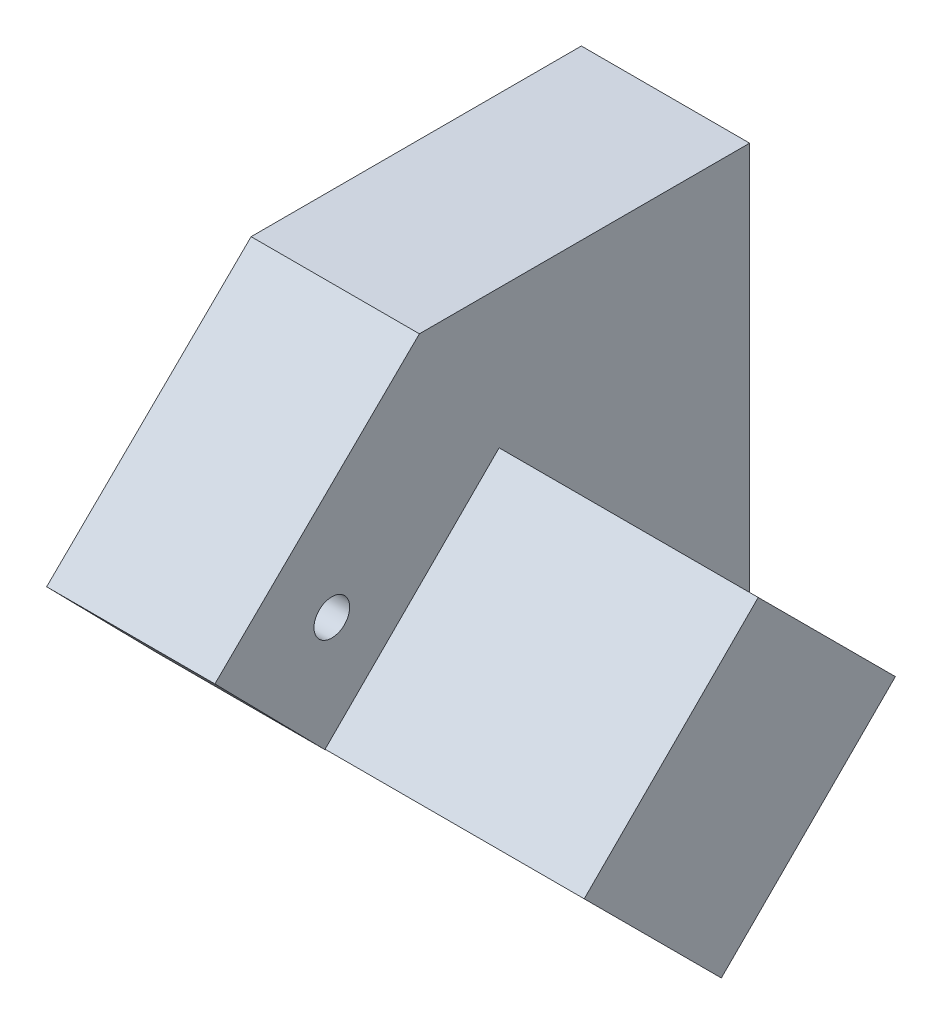
ISO-10303-21;
HEADER;
FILE_DESCRIPTION(('STEP AP214'),'2;1');
FILE_NAME('part.step','',(''),(''),'','','');
FILE_SCHEMA(('AUTOMOTIVE_DESIGN { 1 0 10303 214 1 1 1 1 }'));
ENDSEC;
DATA;
#1=APPLICATION_CONTEXT('core data for automotive mechanical design processes');
#2=APPLICATION_PROTOCOL_DEFINITION('international standard','automotive_design',2000,#1);
#3=PRODUCT_CONTEXT('',#1,'mechanical');
#4=PRODUCT('Part','Part','',(#3));
#5=PRODUCT_RELATED_PRODUCT_CATEGORY('part','',(#4));
#6=PRODUCT_DEFINITION_FORMATION('','',#4);
#7=PRODUCT_DEFINITION_CONTEXT('part definition',#1,'design');
#8=PRODUCT_DEFINITION('design','',#6,#7);
#9=PRODUCT_DEFINITION_SHAPE('','',#8);
#10=(LENGTH_UNIT() NAMED_UNIT(*) SI_UNIT(.MILLI.,.METRE.));
#11=(NAMED_UNIT(*) PLANE_ANGLE_UNIT() SI_UNIT($,.RADIAN.));
#12=(NAMED_UNIT(*) SI_UNIT($,.STERADIAN.) SOLID_ANGLE_UNIT());
#13=UNCERTAINTY_MEASURE_WITH_UNIT(LENGTH_MEASURE(1.E-05),#10,'distance_accuracy_value','');
#14=(GEOMETRIC_REPRESENTATION_CONTEXT(3) GLOBAL_UNCERTAINTY_ASSIGNED_CONTEXT((#13)) GLOBAL_UNIT_ASSIGNED_CONTEXT((#10,
#11,#12)) REPRESENTATION_CONTEXT('',''));
#15=CARTESIAN_POINT('',(0.,0.,0.));
#16=DIRECTION('',(0.,0.,1.));
#17=DIRECTION('',(1.,0.,0.));
#18=AXIS2_PLACEMENT_3D('',#15,#16,#17);
#19=CARTESIAN_POINT('',(0.,-34.0018996616509,4.15689966165091));
#20=DIRECTION('',(0.,-0.707106781186547,0.707106781186548));
#21=DIRECTION('',(0.,-0.707106781186548,-0.707106781186547));
#22=AXIS2_PLACEMENT_3D('',#19,#20,#21);
#23=PLANE('',#22);
#24=DIRECTION('',(0.,0.707106781186548,0.707106781186547));
#25=VECTOR('',#24,1.);
#26=CARTESIAN_POINT('',(10.16,-36.0719996616509,2.08679966165091));
#27=LINE('',#26,#25);
#28=CARTESIAN_POINT('',(10.16,-42.2822996616509,-4.12350033834909));
#29=VERTEX_POINT('',#28);
#30=CARTESIAN_POINT('',(10.16,-40.0558,-1.89700067669817));
#31=VERTEX_POINT('',#30);
#32=EDGE_CURVE('E234',#29,#31,#27,.T.);
#33=ORIENTED_EDGE('',*,*,#32,.T.);
#34=DIRECTION('',(-1.,0.,0.));
#35=VECTOR('',#34,1.);
#36=CARTESIAN_POINT('',(0.,-40.0558,-1.89700067669817));
#37=LINE('',#36,#35);
#38=CARTESIAN_POINT('',(0.,-40.0558,-1.89700067669817));
#39=VERTEX_POINT('',#38);
#40=EDGE_CURVE('E245',#31,#39,#37,.T.);
#41=ORIENTED_EDGE('',*,*,#40,.T.);
#42=DIRECTION('',(0.,-0.707106781186548,-0.707106781186547));
#43=VECTOR('',#42,1.);
#44=CARTESIAN_POINT('',(0.,-34.0018996616509,4.15689966165091));
#45=LINE('',#44,#43);
#46=CARTESIAN_POINT('',(0.,-42.2822996616509,-4.12350033834909));
#47=VERTEX_POINT('',#46);
#48=EDGE_CURVE('E277',#39,#47,#45,.T.);
#49=ORIENTED_EDGE('',*,*,#48,.T.);
#50=DIRECTION('',(1.,0.,0.));
#51=VECTOR('',#50,1.);
#52=CARTESIAN_POINT('',(0.,-42.2822996616509,-4.12350033834909));
#53=LINE('',#52,#51);
#54=EDGE_CURVE('E10',#47,#29,#53,.T.);
#55=ORIENTED_EDGE('',*,*,#54,.T.);
#56=EDGE_LOOP('',(#33,#41,#49,#55));
#57=FACE_BOUND('',#56,.T.);
#58=ADVANCED_FACE('F16',(#57),#23,.T.);
#59=CARTESIAN_POINT('',(0.,0.,-6.35));
#60=DIRECTION('',(0.,1.,0.));
#61=DIRECTION('',(0.,0.,1.));
#62=AXIS2_PLACEMENT_3D('',#59,#60,#61);
#63=PLANE('',#62);
#64=DIRECTION('',(0.,0.,-1.));
#65=VECTOR('',#64,1.);
#66=CARTESIAN_POINT('',(10.16,0.,-4.61570245519068));
#67=LINE('',#66,#65);
#68=CARTESIAN_POINT('',(10.16,0.,13.5894839503606));
#69=VERTEX_POINT('',#68);
#70=CARTESIAN_POINT('',(10.16,0.,-6.35));
#71=VERTEX_POINT('',#70);
#72=EDGE_CURVE('E237',#69,#71,#67,.T.);
#73=ORIENTED_EDGE('',*,*,#72,.T.);
#74=DIRECTION('',(1.,0.,0.));
#75=VECTOR('',#74,1.);
#76=CARTESIAN_POINT('',(0.,0.,-6.35));
#77=LINE('',#76,#75);
#78=CARTESIAN_POINT('',(0.,0.,-6.35));
#79=VERTEX_POINT('',#78);
#80=EDGE_CURVE('E129',#79,#71,#77,.T.);
#81=ORIENTED_EDGE('',*,*,#80,.F.);
#82=DIRECTION('',(0.,0.,1.));
#83=VECTOR('',#82,1.);
#84=CARTESIAN_POINT('',(0.,0.,-6.35));
#85=LINE('',#84,#83);
#86=CARTESIAN_POINT('',(0.,0.,13.5894839503606));
#87=VERTEX_POINT('',#86);
#88=EDGE_CURVE('E175',#79,#87,#85,.T.);
#89=ORIENTED_EDGE('',*,*,#88,.T.);
#90=DIRECTION('',(-1.,0.,0.));
#91=VECTOR('',#90,1.);
#92=CARTESIAN_POINT('',(10.16,0.,13.5894839503606));
#93=LINE('',#92,#91);
#94=EDGE_CURVE('E166',#69,#87,#93,.T.);
#95=ORIENTED_EDGE('',*,*,#94,.F.);
#96=EDGE_LOOP('',(#73,#81,#89,#95));
#97=FACE_BOUND('',#96,.T.);
#98=ADVANCED_FACE('F320',(#97),#63,.T.);
#99=CARTESIAN_POINT('',(0.,-40.0558,-6.35));
#100=DIRECTION('',(0.,-0.707106781186548,-0.707106781186548));
#101=DIRECTION('',(0.,0.707106781186548,-0.707106781186548));
#102=AXIS2_PLACEMENT_3D('',#99,#100,#101);
#103=PLANE('',#102);
#104=DIRECTION('',(0.,-0.707106781186548,0.707106781186548));
#105=VECTOR('',#104,1.);
#106=CARTESIAN_POINT('',(10.16,-38.5423249154127,-7.86347508458728));
#107=LINE('',#106,#105);
#108=CARTESIAN_POINT('',(10.16,-40.0558,-6.35));
#109=VERTEX_POINT('',#108);
#110=EDGE_CURVE('E286',#109,#29,#107,.T.);
#111=ORIENTED_EDGE('',*,*,#110,.T.);
#112=ORIENTED_EDGE('',*,*,#54,.F.);
#113=DIRECTION('',(0.,0.707106781186548,-0.707106781186548));
#114=VECTOR('',#113,1.);
#115=CARTESIAN_POINT('',(0.,-42.2822996616509,-4.12350033834909));
#116=LINE('',#115,#114);
#117=CARTESIAN_POINT('',(0.,-40.0558,-6.35));
#118=VERTEX_POINT('',#117);
#119=EDGE_CURVE('E241',#47,#118,#116,.T.);
#120=ORIENTED_EDGE('',*,*,#119,.T.);
#121=DIRECTION('',(1.,0.,0.));
#122=VECTOR('',#121,1.);
#123=CARTESIAN_POINT('',(0.,-40.0558,-6.35));
#124=LINE('',#123,#122);
#125=EDGE_CURVE('E136',#118,#109,#124,.T.);
#126=ORIENTED_EDGE('',*,*,#125,.T.);
#127=EDGE_LOOP('',(#111,#112,#120,#126));
#128=FACE_BOUND('',#127,.T.);
#129=ADVANCED_FACE('F326',(#128),#103,.T.);
#130=CARTESIAN_POINT('',(0.,-34.0018996616509,4.15689966165091));
#131=DIRECTION('',(0.,-0.707106781186547,0.707106781186548));
#132=DIRECTION('',(0.,-0.707106781186548,-0.707106781186547));
#133=AXIS2_PLACEMENT_3D('',#130,#131,#132);
#134=PLANE('',#133);
#135=DIRECTION('',(0.,0.707106781186548,0.707106781186547));
#136=VECTOR('',#135,1.);
#137=CARTESIAN_POINT('',(10.16,-36.0719996616509,2.08679966165091));
#138=LINE('',#137,#136);
#139=CARTESIAN_POINT('',(10.16,-38.1587993233018,0.));
#140=VERTEX_POINT('',#139);
#141=CARTESIAN_POINT('',(10.16,-27.1554423882763,11.0033569350258));
#142=VERTEX_POINT('',#141);
#143=EDGE_CURVE('E189',#140,#142,#138,.T.);
#144=ORIENTED_EDGE('',*,*,#143,.T.);
#145=DIRECTION('',(1.,0.,0.));
#146=VECTOR('',#145,1.);
#147=CARTESIAN_POINT('',(12.1412,-27.1554423882762,11.0033569350256));
#148=LINE('',#147,#146);
#149=CARTESIAN_POINT('',(25.8064,-27.1554423882762,11.0033569350256));
#150=VERTEX_POINT('',#149);
#151=EDGE_CURVE('E219',#142,#150,#148,.T.);
#152=ORIENTED_EDGE('',*,*,#151,.T.);
#153=DIRECTION('',(0.,-0.707106781186548,-0.707106781186548));
#154=VECTOR('',#153,1.);
#155=CARTESIAN_POINT('',(25.8064,-18.8756462446504,19.2831530786514));
#156=LINE('',#155,#154);
#157=CARTESIAN_POINT('',(25.8064,-18.8756462446504,19.2831530786514));
#158=VERTEX_POINT('',#157);
#159=EDGE_CURVE('E34',#158,#150,#156,.T.);
#160=ORIENTED_EDGE('',*,*,#159,.F.);
#161=DIRECTION('',(1.,0.,0.));
#162=VECTOR('',#161,1.);
#163=CARTESIAN_POINT('',(12.1412,-18.8756462446504,19.2831530786514));
#164=LINE('',#163,#162);
#165=CARTESIAN_POINT('',(10.16,-18.8756462446504,19.2831530786514));
#166=VERTEX_POINT('',#165);
#167=EDGE_CURVE('E226',#166,#158,#164,.T.);
#168=ORIENTED_EDGE('',*,*,#167,.F.);
#169=DIRECTION('',(0.,-0.707106781186548,-0.707106781186548));
#170=VECTOR('',#169,1.);
#171=CARTESIAN_POINT('',(10.16,-17.4898214483012,20.6689778750006));
#172=LINE('',#171,#170);
#173=CARTESIAN_POINT('',(10.16,-18.9129057166653,19.2458936066365));
#174=VERTEX_POINT('',#173);
#175=EDGE_CURVE('E257',#166,#174,#172,.T.);
#176=ORIENTED_EDGE('',*,*,#175,.T.);
#177=DIRECTION('',(-1.,0.,0.));
#178=VECTOR('',#177,1.);
#179=CARTESIAN_POINT('',(11.1506,-18.9129057166653,19.2458936066365));
#180=LINE('',#179,#178);
#181=CARTESIAN_POINT('',(0.,-18.9129057166653,19.2458936066365));
#182=VERTEX_POINT('',#181);
#183=EDGE_CURVE('E197',#174,#182,#180,.T.);
#184=ORIENTED_EDGE('',*,*,#183,.T.);
#185=DIRECTION('',(0.,0.707106781186547,0.707106781186548));
#186=VECTOR('',#185,1.);
#187=CARTESIAN_POINT('',(0.,-25.0854933523698,13.0733059709321));
#188=LINE('',#187,#186);
#189=CARTESIAN_POINT('',(0.,-38.1587993233018,0.));
#190=VERTEX_POINT('',#189);
#191=EDGE_CURVE('E183',#190,#182,#188,.T.);
#192=ORIENTED_EDGE('',*,*,#191,.F.);
#193=DIRECTION('',(1.,0.,0.));
#194=VECTOR('',#193,1.);
#195=CARTESIAN_POINT('',(0.,-38.1587993233018,0.));
#196=LINE('',#195,#194);
#197=EDGE_CURVE('E243',#190,#140,#196,.T.);
#198=ORIENTED_EDGE('',*,*,#197,.T.);
#199=EDGE_LOOP('',(#144,#152,#160,#168,#176,#184,#192,#198));
#200=FACE_BOUND('',#199,.T.);
#201=CARTESIAN_POINT('',(19.2656923686453,-23.0155443164633,15.1432550068385));
#202=DIRECTION('',(0.,0.707106781186548,-0.707106781186547));
#203=DIRECTION('',(1.,0.,0.));
#204=AXIS2_PLACEMENT_3D('',#201,#202,#203);
#205=CIRCLE('',#204,4.5085);
#206=CARTESIAN_POINT('',(14.7571923686453,-23.0155443164633,15.1432550068385));
#207=VERTEX_POINT('',#206);
#208=EDGE_CURVE('E207',#207,#207,#205,.T.);
#209=ORIENTED_EDGE('',*,*,#208,.T.);
#210=EDGE_LOOP('',(#209));
#211=FACE_BOUND('',#210,.T.);
#212=ADVANCED_FACE('F331',(#200,#211),#134,.T.);
#213=CARTESIAN_POINT('',(0.,-5.08,-7.62));
#214=DIRECTION('',(-1.,0.,0.));
#215=DIRECTION('',(0.,0.,-1.));
#216=AXIS2_PLACEMENT_3D('',#213,#214,#215);
#217=CYLINDRICAL_SURFACE('',#216,2.54);
#218=DIRECTION('',(-1.,0.,0.));
#219=VECTOR('',#218,1.);
#220=CARTESIAN_POINT('',(0.,-2.88029547438753,-6.35));
#221=LINE('',#220,#219);
#222=CARTESIAN_POINT('',(6.35,-2.88029547438753,-6.35));
#223=VERTEX_POINT('',#222);
#224=CARTESIAN_POINT('',(0.,-2.88029547438753,-6.35));
#225=VERTEX_POINT('',#224);
#226=EDGE_CURVE('E214',#223,#225,#221,.T.);
#227=ORIENTED_EDGE('',*,*,#226,.F.);
#228=CARTESIAN_POINT('',(6.35,-5.08,-7.62));
#229=DIRECTION('',(1.,0.,0.));
#230=DIRECTION('',(0.,0.,-1.));
#231=AXIS2_PLACEMENT_3D('',#228,#229,#230);
#232=CIRCLE('',#231,2.54);
#233=CARTESIAN_POINT('',(6.35,-7.27970452561247,-6.35));
#234=VERTEX_POINT('',#233);
#235=EDGE_CURVE('E26',#234,#223,#232,.T.);
#236=ORIENTED_EDGE('',*,*,#235,.F.);
#237=DIRECTION('',(1.,0.,0.));
#238=VECTOR('',#237,1.);
#239=CARTESIAN_POINT('',(0.,-7.27970452561247,-6.35));
#240=LINE('',#239,#238);
#241=CARTESIAN_POINT('',(0.,-7.27970452561247,-6.35));
#242=VERTEX_POINT('',#241);
#243=EDGE_CURVE('E198',#242,#234,#240,.T.);
#244=ORIENTED_EDGE('',*,*,#243,.F.);
#245=CARTESIAN_POINT('',(0.,-5.08,-7.62));
#246=DIRECTION('',(1.,0.,0.));
#247=DIRECTION('',(0.,0.,-1.));
#248=AXIS2_PLACEMENT_3D('',#245,#246,#247);
#249=CIRCLE('',#248,2.54);
#250=EDGE_CURVE('E213',#242,#225,#249,.T.);
#251=ORIENTED_EDGE('',*,*,#250,.T.);
#252=EDGE_LOOP('',(#227,#236,#244,#251));
#253=FACE_BOUND('',#252,.T.);
#254=ADVANCED_FACE('F333',(#253),#217,.T.);
#255=CARTESIAN_POINT('',(6.35,-5.08,-7.62));
#256=DIRECTION('',(1.,0.,0.));
#257=DIRECTION('',(0.,0.,-1.));
#258=AXIS2_PLACEMENT_3D('',#255,#256,#257);
#259=PLANE('',#258);
#260=DIRECTION('',(0.,1.,0.));
#261=VECTOR('',#260,1.);
#262=CARTESIAN_POINT('',(6.35,-22.5679,-6.35));
#263=LINE('',#262,#261);
#264=EDGE_CURVE('E201',#234,#223,#263,.T.);
#265=ORIENTED_EDGE('',*,*,#264,.F.);
#266=ORIENTED_EDGE('',*,*,#235,.T.);
#267=EDGE_LOOP('',(#265,#266));
#268=FACE_BOUND('',#267,.T.);
#269=ADVANCED_FACE('F338',(#268),#259,.T.);
#270=CARTESIAN_POINT('',(0.,-34.9758,-7.62));
#271=DIRECTION('',(-1.,0.,0.));
#272=DIRECTION('',(0.,0.,-1.));
#273=AXIS2_PLACEMENT_3D('',#270,#271,#272);
#274=CYLINDRICAL_SURFACE('',#273,2.54);
#275=DIRECTION('',(-1.,0.,0.));
#276=VECTOR('',#275,1.);
#277=CARTESIAN_POINT('',(0.,-32.7760954743875,-6.35));
#278=LINE('',#277,#276);
#279=CARTESIAN_POINT('',(6.35,-32.7760954743875,-6.35));
#280=VERTEX_POINT('',#279);
#281=CARTESIAN_POINT('',(0.,-32.7760954743875,-6.35));
#282=VERTEX_POINT('',#281);
#283=EDGE_CURVE('E202',#280,#282,#278,.T.);
#284=ORIENTED_EDGE('',*,*,#283,.F.);
#285=CARTESIAN_POINT('',(6.35,-34.9758,-7.62));
#286=DIRECTION('',(1.,0.,0.));
#287=DIRECTION('',(0.,0.,-1.));
#288=AXIS2_PLACEMENT_3D('',#285,#286,#287);
#289=CIRCLE('',#288,2.54);
#290=CARTESIAN_POINT('',(6.35,-37.1755045256125,-6.35));
#291=VERTEX_POINT('',#290);
#292=EDGE_CURVE('E187',#291,#280,#289,.T.);
#293=ORIENTED_EDGE('',*,*,#292,.F.);
#294=DIRECTION('',(1.,0.,0.));
#295=VECTOR('',#294,1.);
#296=CARTESIAN_POINT('',(0.,-37.1755045256125,-6.35));
#297=LINE('',#296,#295);
#298=CARTESIAN_POINT('',(0.,-37.1755045256125,-6.35));
#299=VERTEX_POINT('',#298);
#300=EDGE_CURVE('E266',#299,#291,#297,.T.);
#301=ORIENTED_EDGE('',*,*,#300,.F.);
#302=CARTESIAN_POINT('',(0.,-34.9758,-7.62));
#303=DIRECTION('',(1.,0.,0.));
#304=DIRECTION('',(0.,0.,-1.));
#305=AXIS2_PLACEMENT_3D('',#302,#303,#304);
#306=CIRCLE('',#305,2.54);
#307=EDGE_CURVE('E242',#299,#282,#306,.T.);
#308=ORIENTED_EDGE('',*,*,#307,.T.);
#309=EDGE_LOOP('',(#284,#293,#301,#308));
#310=FACE_BOUND('',#309,.T.);
#311=ADVANCED_FACE('F375',(#310),#274,.T.);
#312=CARTESIAN_POINT('',(6.35,-34.9758,-7.62));
#313=DIRECTION('',(1.,0.,0.));
#314=DIRECTION('',(0.,0.,-1.));
#315=AXIS2_PLACEMENT_3D('',#312,#313,#314);
#316=PLANE('',#315);
#317=DIRECTION('',(0.,1.,0.));
#318=VECTOR('',#317,1.);
#319=CARTESIAN_POINT('',(6.35,-37.5158,-6.35));
#320=LINE('',#319,#318);
#321=EDGE_CURVE('E269',#291,#280,#320,.T.);
#322=ORIENTED_EDGE('',*,*,#321,.F.);
#323=ORIENTED_EDGE('',*,*,#292,.T.);
#324=EDGE_LOOP('',(#322,#323));
#325=FACE_BOUND('',#324,.T.);
#326=ADVANCED_FACE('F372',(#325),#316,.T.);
#327=CARTESIAN_POINT('',(26.3652,-40.0558,0.));
#328=DIRECTION('',(0.,0.,1.));
#329=DIRECTION('',(0.,1.,0.));
#330=AXIS2_PLACEMENT_3D('',#327,#328,#329);
#331=PLANE('',#330);
#332=DIRECTION('',(0.,-1.,0.));
#333=VECTOR('',#332,1.);
#334=CARTESIAN_POINT('',(10.16,-36.4722249154128,0.));
#335=LINE('',#334,#333);
#336=CARTESIAN_POINT('',(10.16,-38.1254,0.));
#337=VERTEX_POINT('',#336);
#338=EDGE_CURVE('E192',#337,#140,#335,.T.);
#339=ORIENTED_EDGE('',*,*,#338,.T.);
#340=ORIENTED_EDGE('',*,*,#197,.F.);
#341=DIRECTION('',(0.,-1.,0.));
#342=VECTOR('',#341,1.);
#343=CARTESIAN_POINT('',(0.,-35.9156,0.));
#344=LINE('',#343,#342);
#345=CARTESIAN_POINT('',(0.,-38.1254,0.));
#346=VERTEX_POINT('',#345);
#347=EDGE_CURVE('E193',#346,#190,#344,.T.);
#348=ORIENTED_EDGE('',*,*,#347,.F.);
#349=DIRECTION('',(-1.,0.,0.));
#350=VECTOR('',#349,1.);
#351=CARTESIAN_POINT('',(26.3652,-38.1254,0.));
#352=LINE('',#351,#350);
#353=EDGE_CURVE('E271',#337,#346,#352,.T.);
#354=ORIENTED_EDGE('',*,*,#353,.F.);
#355=EDGE_LOOP('',(#339,#340,#348,#354));
#356=FACE_BOUND('',#355,.T.);
#357=ADVANCED_FACE('F366',(#356),#331,.F.);
#358=CARTESIAN_POINT('',(26.3652,-38.1254,0.));
#359=DIRECTION('',(0.,0.700909617671485,-0.713250101896672));
#360=DIRECTION('',(0.,-0.713250101896672,-0.700909617671485));
#361=AXIS2_PLACEMENT_3D('',#358,#359,#360);
#362=PLANE('',#361);
#363=DIRECTION('',(0.,0.713250101896672,0.700909617671485));
#364=VECTOR('',#363,1.);
#365=CARTESIAN_POINT('',(10.16,-38.102353450991,0.0226478030800242));
#366=LINE('',#365,#364);
#367=EDGE_CURVE('E231',#31,#337,#366,.T.);
#368=ORIENTED_EDGE('',*,*,#367,.T.);
#369=ORIENTED_EDGE('',*,*,#353,.T.);
#370=DIRECTION('',(0.,0.713250101896672,0.700909617671485));
#371=VECTOR('',#370,1.);
#372=CARTESIAN_POINT('',(0.,-38.7036800386154,-0.568274774437638));
#373=LINE('',#372,#371);
#374=EDGE_CURVE('E274',#39,#346,#373,.T.);
#375=ORIENTED_EDGE('',*,*,#374,.F.);
#376=ORIENTED_EDGE('',*,*,#40,.F.);
#377=EDGE_LOOP('',(#368,#369,#375,#376));
#378=FACE_BOUND('',#377,.T.);
#379=ADVANCED_FACE('F362',(#378),#362,.F.);
#380=CARTESIAN_POINT('',(25.8064,-17.7620944856379,9.88980517601307));
#381=DIRECTION('',(1.,0.,0.));
#382=DIRECTION('',(0.,0.,-1.));
#383=AXIS2_PLACEMENT_3D('',#380,#381,#382);
#384=PLANE('',#383);
#385=DIRECTION('',(0.,0.707106781186548,0.707106781186548));
#386=VECTOR('',#385,1.);
#387=CARTESIAN_POINT('',(25.8064,-16.6485427266252,0.496457273374729));
#388=LINE('',#387,#386);
#389=CARTESIAN_POINT('',(25.8064,-16.6485427266252,0.496457273374729));
#390=VERTEX_POINT('',#389);
#391=CARTESIAN_POINT('',(25.8064,-8.36874658299951,8.77625341700049));
#392=VERTEX_POINT('',#391);
#393=EDGE_CURVE('E224',#390,#392,#388,.T.);
#394=ORIENTED_EDGE('',*,*,#393,.T.);
#395=DIRECTION('',(0.,-0.707106781186548,0.707106781186547));
#396=VECTOR('',#395,1.);
#397=CARTESIAN_POINT('',(25.8064,-8.36874658299951,8.77625341700049));
#398=LINE('',#397,#396);
#399=EDGE_CURVE('E272',#392,#158,#398,.T.);
#400=ORIENTED_EDGE('',*,*,#399,.T.);
#401=ORIENTED_EDGE('',*,*,#159,.T.);
#402=DIRECTION('',(0.,0.707106781186548,-0.707106781186547));
#403=VECTOR('',#402,1.);
#404=CARTESIAN_POINT('',(25.8064,-27.1554423882762,11.0033569350256));
#405=LINE('',#404,#403);
#406=EDGE_CURVE('E216',#150,#390,#405,.T.);
#407=ORIENTED_EDGE('',*,*,#406,.T.);
#408=EDGE_LOOP('',(#394,#400,#401,#407));
#409=FACE_BOUND('',#408,.T.);
#410=ADVANCED_FACE('F365',(#409),#384,.T.);
#411=CARTESIAN_POINT('',(12.1412,-8.36874658299951,8.77625341700049));
#412=DIRECTION('',(0.,0.707106781186547,0.707106781186548));
#413=DIRECTION('',(0.,-0.707106781186548,0.707106781186547));
#414=AXIS2_PLACEMENT_3D('',#411,#412,#413);
#415=PLANE('',#414);
#416=DIRECTION('',(0.,-0.707106781186548,0.707106781186547));
#417=VECTOR('',#416,1.);
#418=CARTESIAN_POINT('',(10.16,-9.34085864937649,9.74836548337747));
#419=LINE('',#418,#417);
#420=CARTESIAN_POINT('',(10.16,-8.36874658299951,8.77625341700049));
#421=VERTEX_POINT('',#420);
#422=EDGE_CURVE('E256',#421,#166,#419,.T.);
#423=ORIENTED_EDGE('',*,*,#422,.T.);
#424=ORIENTED_EDGE('',*,*,#167,.T.);
#425=ORIENTED_EDGE('',*,*,#399,.F.);
#426=DIRECTION('',(1.,0.,0.));
#427=VECTOR('',#426,1.);
#428=CARTESIAN_POINT('',(12.1412,-8.36874658299951,8.77625341700049));
#429=LINE('',#428,#427);
#430=EDGE_CURVE('E221',#421,#392,#429,.T.);
#431=ORIENTED_EDGE('',*,*,#430,.F.);
#432=EDGE_LOOP('',(#423,#424,#425,#431));
#433=FACE_BOUND('',#432,.T.);
#434=ADVANCED_FACE('F370',(#433),#415,.T.);
#435=CARTESIAN_POINT('',(12.1412,-27.1554423882762,11.0033569350256));
#436=DIRECTION('',(0.,-0.707106781186547,-0.707106781186548));
#437=DIRECTION('',(0.,0.707106781186548,-0.707106781186547));
#438=AXIS2_PLACEMENT_3D('',#435,#436,#437);
#439=PLANE('',#438);
#440=DIRECTION('',(0.,0.707106781186548,-0.707106781186547));
#441=VECTOR('',#440,1.);
#442=CARTESIAN_POINT('',(10.16,-25.5211392654298,9.36905381217931));
#443=LINE('',#442,#441);
#444=CARTESIAN_POINT('',(10.16,-16.6485427266252,0.496457273374729));
#445=VERTEX_POINT('',#444);
#446=EDGE_CURVE('E167',#142,#445,#443,.T.);
#447=ORIENTED_EDGE('',*,*,#446,.T.);
#448=DIRECTION('',(-1.,0.,0.));
#449=VECTOR('',#448,1.);
#450=CARTESIAN_POINT('',(12.1412,-16.6485427266252,0.496457273374729));
#451=LINE('',#450,#449);
#452=EDGE_CURVE('E220',#390,#445,#451,.T.);
#453=ORIENTED_EDGE('',*,*,#452,.F.);
#454=ORIENTED_EDGE('',*,*,#406,.F.);
#455=ORIENTED_EDGE('',*,*,#151,.F.);
#456=EDGE_LOOP('',(#447,#453,#454,#455));
#457=FACE_BOUND('',#456,.T.);
#458=ADVANCED_FACE('F357',(#457),#439,.T.);
#459=CARTESIAN_POINT('',(12.1412,-16.6485427266252,0.496457273374729));
#460=DIRECTION('',(0.,0.707106781186548,-0.707106781186548));
#461=DIRECTION('',(0.,0.707106781186548,0.707106781186548));
#462=AXIS2_PLACEMENT_3D('',#459,#460,#461);
#463=PLANE('',#462);
#464=CARTESIAN_POINT('',(19.2656923686453,-12.5086446548124,4.63635534518761));
#465=DIRECTION('',(0.,-0.707106781186548,0.707106781186547));
#466=DIRECTION('',(1.,0.,0.));
#467=AXIS2_PLACEMENT_3D('',#464,#465,#466);
#468=CIRCLE('',#467,4.5085);
#469=CARTESIAN_POINT('',(14.7571923686453,-12.5086446548124,4.63635534518761));
#470=VERTEX_POINT('',#469);
#471=EDGE_CURVE('E209',#470,#470,#468,.T.);
#472=ORIENTED_EDGE('',*,*,#471,.T.);
#473=EDGE_LOOP('',(#472));
#474=FACE_BOUND('',#473,.T.);
#475=DIRECTION('',(0.,0.707106781186548,0.707106781186548));
#476=VECTOR('',#475,1.);
#477=CARTESIAN_POINT('',(10.16,-11.1228198584632,6.0221801415368));
#478=LINE('',#477,#476);
#479=EDGE_CURVE('E253',#445,#421,#478,.T.);
#480=ORIENTED_EDGE('',*,*,#479,.T.);
#481=ORIENTED_EDGE('',*,*,#430,.T.);
#482=ORIENTED_EDGE('',*,*,#393,.F.);
#483=ORIENTED_EDGE('',*,*,#452,.T.);
#484=EDGE_LOOP('',(#480,#481,#482,#483));
#485=FACE_BOUND('',#484,.T.);
#486=ADVANCED_FACE('F348',(#474,#485),#463,.T.);
#487=CARTESIAN_POINT('',(19.2656923686453,-12.5086446548124,4.63635534518761));
#488=DIRECTION('',(0.,0.707106781186548,-0.707106781186548));
#489=DIRECTION('',(1.,0.,0.));
#490=AXIS2_PLACEMENT_3D('',#487,#488,#489);
#491=CYLINDRICAL_SURFACE('',#490,4.5085);
#492=ORIENTED_EDGE('',*,*,#471,.F.);
#493=EDGE_LOOP('',(#492));
#494=FACE_BOUND('',#493,.T.);
#495=ORIENTED_EDGE('',*,*,#208,.F.);
#496=EDGE_LOOP('',(#495));
#497=FACE_BOUND('',#496,.T.);
#498=ADVANCED_FACE('F345',(#494,#497),#491,.F.);
#499=CARTESIAN_POINT('',(0.,-40.0558,-6.35));
#500=DIRECTION('',(0.,0.,-1.));
#501=DIRECTION('',(0.,1.,0.));
#502=AXIS2_PLACEMENT_3D('',#499,#500,#501);
#503=PLANE('',#502);
#504=DIRECTION('',(0.,-1.,0.));
#505=VECTOR('',#504,1.);
#506=CARTESIAN_POINT('',(10.16,-36.4722249154128,-6.35));
#507=LINE('',#506,#505);
#508=EDGE_CURVE('E285',#71,#109,#507,.T.);
#509=ORIENTED_EDGE('',*,*,#508,.T.);
#510=ORIENTED_EDGE('',*,*,#125,.F.);
#511=DIRECTION('',(0.,-1.,0.));
#512=VECTOR('',#511,1.);
#513=CARTESIAN_POINT('',(0.,-27.6352,-6.35));
#514=LINE('',#513,#512);
#515=EDGE_CURVE('E238',#299,#118,#514,.T.);
#516=ORIENTED_EDGE('',*,*,#515,.F.);
#517=ORIENTED_EDGE('',*,*,#300,.T.);
#518=ORIENTED_EDGE('',*,*,#321,.T.);
#519=ORIENTED_EDGE('',*,*,#283,.T.);
#520=DIRECTION('',(0.,-1.,0.));
#521=VECTOR('',#520,1.);
#522=CARTESIAN_POINT('',(0.,-27.6352,-6.35));
#523=LINE('',#522,#521);
#524=EDGE_CURVE('E230',#242,#282,#523,.T.);
#525=ORIENTED_EDGE('',*,*,#524,.F.);
#526=ORIENTED_EDGE('',*,*,#243,.T.);
#527=ORIENTED_EDGE('',*,*,#264,.T.);
#528=ORIENTED_EDGE('',*,*,#226,.T.);
#529=DIRECTION('',(0.,-1.,0.));
#530=VECTOR('',#529,1.);
#531=CARTESIAN_POINT('',(0.,-27.6352,-6.35));
#532=LINE('',#531,#530);
#533=EDGE_CURVE('E210',#79,#225,#532,.T.);
#534=ORIENTED_EDGE('',*,*,#533,.F.);
#535=ORIENTED_EDGE('',*,*,#80,.T.);
#536=EDGE_LOOP('',(#509,#510,#516,#517,#518,#519,#525,#526,#527,#528,#534,#535));
#537=FACE_BOUND('',#536,.T.);
#538=ADVANCED_FACE('F347',(#537),#503,.T.);
#539=CARTESIAN_POINT('',(10.16,0.,0.));
#540=DIRECTION('',(0.,-0.713250101896672,-0.700909617671485));
#541=DIRECTION('',(0.,-0.700909617671485,0.713250101896672));
#542=AXIS2_PLACEMENT_3D('',#539,#540,#541);
#543=PLANE('',#542);
#544=ORIENTED_EDGE('',*,*,#183,.F.);
#545=DIRECTION('',(0.,0.700909617671485,-0.713250101896672));
#546=VECTOR('',#545,1.);
#547=CARTESIAN_POINT('',(10.16,-18.9273511881352,19.2605934106313));
#548=LINE('',#547,#546);
#549=CARTESIAN_POINT('',(10.16,-18.9273511881352,19.2605934106313));
#550=VERTEX_POINT('',#549);
#551=EDGE_CURVE('E205',#550,#174,#548,.T.);
#552=ORIENTED_EDGE('',*,*,#551,.F.);
#553=DIRECTION('',(-1.,0.,0.));
#554=VECTOR('',#553,1.);
#555=CARTESIAN_POINT('',(10.16,-18.9273511881352,19.2605934106313));
#556=LINE('',#555,#554);
#557=CARTESIAN_POINT('',(0.,-18.9273511881352,19.2605934106313));
#558=VERTEX_POINT('',#557);
#559=EDGE_CURVE('E194',#550,#558,#556,.T.);
#560=ORIENTED_EDGE('',*,*,#559,.T.);
#561=DIRECTION('',(0.,-0.700909617671485,0.713250101896672));
#562=VECTOR('',#561,1.);
#563=CARTESIAN_POINT('',(0.,-5.56623122348871,5.66423243059928));
#564=LINE('',#563,#562);
#565=EDGE_CURVE('E181',#182,#558,#564,.T.);
#566=ORIENTED_EDGE('',*,*,#565,.F.);
#567=EDGE_LOOP('',(#544,#552,#560,#566));
#568=FACE_BOUND('',#567,.T.);
#569=ADVANCED_FACE('F355',(#568),#543,.T.);
#570=CARTESIAN_POINT('',(10.16,-18.9273511881352,19.2605934106313));
#571=DIRECTION('',(0.,-0.700909617671485,0.713250101896672));
#572=DIRECTION('',(0.,0.713250101896672,0.700909617671485));
#573=AXIS2_PLACEMENT_3D('',#570,#571,#572);
#574=PLANE('',#573);
#575=DIRECTION('',(0.,0.713250101896672,0.700909617671485));
#576=VECTOR('',#575,1.);
#577=CARTESIAN_POINT('',(0.,-18.0929577616802,20.0805503597701));
#578=LINE('',#577,#576);
#579=CARTESIAN_POINT('',(0.,-12.1336439675694,25.9367575189522));
#580=VERTEX_POINT('',#579);
#581=EDGE_CURVE('E158',#558,#580,#578,.T.);
#582=ORIENTED_EDGE('',*,*,#581,.F.);
#583=ORIENTED_EDGE('',*,*,#559,.F.);
#584=DIRECTION('',(0.,-0.713250101896672,-0.700909617671485));
#585=VECTOR('',#584,1.);
#586=CARTESIAN_POINT('',(10.16,-12.1336439675694,25.9367575189522));
#587=LINE('',#586,#585);
#588=CARTESIAN_POINT('',(10.16,-12.1336439675694,25.9367575189522));
#589=VERTEX_POINT('',#588);
#590=EDGE_CURVE('E161',#589,#550,#587,.T.);
#591=ORIENTED_EDGE('',*,*,#590,.F.);
#592=DIRECTION('',(-1.,0.,0.));
#593=VECTOR('',#592,1.);
#594=CARTESIAN_POINT('',(10.16,-12.1336439675694,25.9367575189522));
#595=LINE('',#594,#593);
#596=EDGE_CURVE('E155',#589,#580,#595,.T.);
#597=ORIENTED_EDGE('',*,*,#596,.T.);
#598=EDGE_LOOP('',(#582,#583,#591,#597));
#599=FACE_BOUND('',#598,.T.);
#600=ADVANCED_FACE('F18',(#599),#574,.T.);
#601=CARTESIAN_POINT('',(10.16,-12.1336439675694,25.9367575189522));
#602=DIRECTION('',(0.,0.713250101896672,0.700909617671485));
#603=DIRECTION('',(0.,0.700909617671485,-0.713250101896672));
#604=AXIS2_PLACEMENT_3D('',#601,#602,#603);
#605=PLANE('',#604);
#606=DIRECTION('',(0.,0.700909617671485,-0.713250101896672));
#607=VECTOR('',#606,1.);
#608=CARTESIAN_POINT('',(0.,-8.23619959699051,21.9706932442358));
#609=LINE('',#608,#607);
#610=EDGE_CURVE('E170',#580,#87,#609,.T.);
#611=ORIENTED_EDGE('',*,*,#610,.F.);
#612=ORIENTED_EDGE('',*,*,#596,.F.);
#613=DIRECTION('',(0.,-0.700909617671485,0.713250101896672));
#614=VECTOR('',#613,1.);
#615=CARTESIAN_POINT('',(10.16,6.7937072205658,6.67616410832089));
#616=LINE('',#615,#614);
#617=EDGE_CURVE('E206',#69,#589,#616,.T.);
#618=ORIENTED_EDGE('',*,*,#617,.F.);
#619=ORIENTED_EDGE('',*,*,#94,.T.);
#620=EDGE_LOOP('',(#611,#612,#618,#619));
#621=FACE_BOUND('',#620,.T.);
#622=ADVANCED_FACE('F171',(#621),#605,.T.);
#623=CARTESIAN_POINT('',(10.16,-13.9925640302673,-2.88140491038137));
#624=DIRECTION('',(1.,0.,0.));
#625=DIRECTION('',(0.,0.,-1.));
#626=AXIS2_PLACEMENT_3D('',#623,#624,#625);
#627=PLANE('',#626);
#628=ORIENTED_EDGE('',*,*,#143,.F.);
#629=ORIENTED_EDGE('',*,*,#338,.F.);
#630=ORIENTED_EDGE('',*,*,#367,.F.);
#631=ORIENTED_EDGE('',*,*,#32,.F.);
#632=ORIENTED_EDGE('',*,*,#110,.F.);
#633=ORIENTED_EDGE('',*,*,#508,.F.);
#634=ORIENTED_EDGE('',*,*,#72,.F.);
#635=ORIENTED_EDGE('',*,*,#617,.T.);
#636=ORIENTED_EDGE('',*,*,#590,.T.);
#637=ORIENTED_EDGE('',*,*,#551,.T.);
#638=ORIENTED_EDGE('',*,*,#175,.F.);
#639=ORIENTED_EDGE('',*,*,#422,.F.);
#640=ORIENTED_EDGE('',*,*,#479,.F.);
#641=ORIENTED_EDGE('',*,*,#446,.F.);
#642=EDGE_LOOP('',(#628,#629,#630,#631,#632,#633,#634,#635,#636,#637,#638,#639,#640,#641));
#643=FACE_BOUND('',#642,.T.);
#644=CARTESIAN_POINT('',(10.16,-12.1837089211762,18.8773950399256));
#645=DIRECTION('',(-1.,0.,0.));
#646=DIRECTION('',(0.,0.,-1.));
#647=AXIS2_PLACEMENT_3D('',#644,#645,#646);
#648=CIRCLE('',#647,1.07823);
#649=CARTESIAN_POINT('',(10.16,-12.1837089211762,17.7991650399256));
#650=VERTEX_POINT('',#649);
#651=EDGE_CURVE('E265',#650,#650,#648,.T.);
#652=ORIENTED_EDGE('',*,*,#651,.T.);
#653=EDGE_LOOP('',(#652));
#654=FACE_BOUND('',#653,.T.);
#655=ADVANCED_FACE('F302',(#643,#654),#627,.T.);
#656=CARTESIAN_POINT('',(0.,-17.7620944856379,9.88980517601306));
#657=DIRECTION('',(1.,0.,0.));
#658=DIRECTION('',(0.,0.,-1.));
#659=AXIS2_PLACEMENT_3D('',#656,#657,#658);
#660=PLANE('',#659);
#661=ORIENTED_EDGE('',*,*,#191,.T.);
#662=ORIENTED_EDGE('',*,*,#565,.T.);
#663=ORIENTED_EDGE('',*,*,#581,.T.);
#664=ORIENTED_EDGE('',*,*,#610,.T.);
#665=ORIENTED_EDGE('',*,*,#88,.F.);
#666=ORIENTED_EDGE('',*,*,#533,.T.);
#667=ORIENTED_EDGE('',*,*,#250,.F.);
#668=ORIENTED_EDGE('',*,*,#524,.T.);
#669=ORIENTED_EDGE('',*,*,#307,.F.);
#670=ORIENTED_EDGE('',*,*,#515,.T.);
#671=ORIENTED_EDGE('',*,*,#119,.F.);
#672=ORIENTED_EDGE('',*,*,#48,.F.);
#673=ORIENTED_EDGE('',*,*,#374,.T.);
#674=ORIENTED_EDGE('',*,*,#347,.T.);
#675=EDGE_LOOP('',(#661,#662,#663,#664,#665,#666,#667,#668,#669,#670,#671,#672,#673,#674));
#676=FACE_BOUND('',#675,.T.);
#677=CARTESIAN_POINT('',(0.,-12.1837089211762,18.8773950399256));
#678=DIRECTION('',(1.,0.,0.));
#679=DIRECTION('',(0.,0.,-1.));
#680=AXIS2_PLACEMENT_3D('',#677,#678,#679);
#681=CIRCLE('',#680,1.07823);
#682=CARTESIAN_POINT('',(0.,-12.1837089211762,19.9556250399256));
#683=VERTEX_POINT('',#682);
#684=EDGE_CURVE('E263',#683,#683,#681,.T.);
#685=ORIENTED_EDGE('',*,*,#684,.T.);
#686=EDGE_LOOP('',(#685));
#687=FACE_BOUND('',#686,.T.);
#688=ADVANCED_FACE('F178',(#676,#687),#660,.F.);
#689=CARTESIAN_POINT('',(-51.1322429759238,-12.1837089211762,18.8773950399256));
#690=DIRECTION('',(-1.,0.,0.));
#691=DIRECTION('',(0.,0.,-1.));
#692=AXIS2_PLACEMENT_3D('',#689,#690,#691);
#693=CYLINDRICAL_SURFACE('',#692,1.07823);
#694=ORIENTED_EDGE('',*,*,#651,.F.);
#695=EDGE_LOOP('',(#694));
#696=FACE_BOUND('',#695,.T.);
#697=ORIENTED_EDGE('',*,*,#684,.F.);
#698=EDGE_LOOP('',(#697));
#699=FACE_BOUND('',#698,.T.);
#700=ADVANCED_FACE('F304',(#696,#699),#693,.F.);
#701=CLOSED_SHELL('',(#58,#98,#129,#212,#254,#269,#311,#326,#357,#379,#410,#434,#458,#486,#498,
#538,#569,#600,#622,#655,#688,#700));
#702=MANIFOLD_SOLID_BREP('B1',#701);
#703=ADVANCED_BREP_SHAPE_REPRESENTATION('',(#18,#702),#14);
#704=SHAPE_DEFINITION_REPRESENTATION(#9,#703);
ENDSEC;
END-ISO-10303-21;
